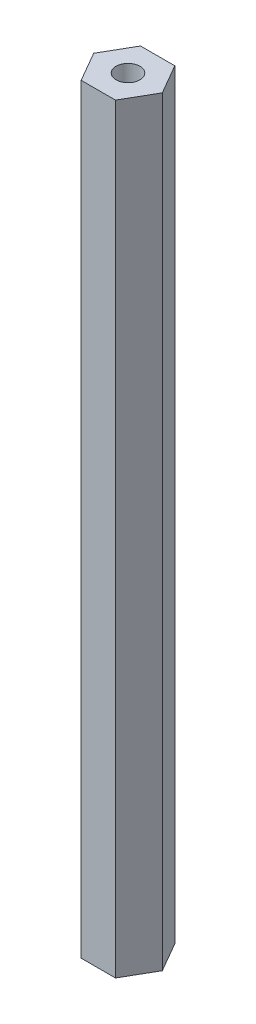
ISO-10303-21;
HEADER;
FILE_DESCRIPTION(('STEP AP214'),'2;1');
FILE_NAME('part.step','',(''),(''),'','','');
FILE_SCHEMA(('AUTOMOTIVE_DESIGN { 1 0 10303 214 1 1 1 1 }'));
ENDSEC;
DATA;
#1=APPLICATION_CONTEXT('core data for automotive mechanical design processes');
#2=APPLICATION_PROTOCOL_DEFINITION('international standard','automotive_design',2000,#1);
#3=PRODUCT_CONTEXT('',#1,'mechanical');
#4=PRODUCT('Part','Part','',(#3));
#5=PRODUCT_RELATED_PRODUCT_CATEGORY('part','',(#4));
#6=PRODUCT_DEFINITION_FORMATION('','',#4);
#7=PRODUCT_DEFINITION_CONTEXT('part definition',#1,'design');
#8=PRODUCT_DEFINITION('design','',#6,#7);
#9=PRODUCT_DEFINITION_SHAPE('','',#8);
#10=(LENGTH_UNIT() NAMED_UNIT(*) SI_UNIT(.MILLI.,.METRE.));
#11=(NAMED_UNIT(*) PLANE_ANGLE_UNIT() SI_UNIT($,.RADIAN.));
#12=(NAMED_UNIT(*) SI_UNIT($,.STERADIAN.) SOLID_ANGLE_UNIT());
#13=UNCERTAINTY_MEASURE_WITH_UNIT(LENGTH_MEASURE(1.E-05),#10,'distance_accuracy_value','');
#14=(GEOMETRIC_REPRESENTATION_CONTEXT(3) GLOBAL_UNCERTAINTY_ASSIGNED_CONTEXT((#13)) GLOBAL_UNIT_ASSIGNED_CONTEXT((#10,
#11,#12)) REPRESENTATION_CONTEXT('',''));
#15=CARTESIAN_POINT('',(0.,0.,0.));
#16=DIRECTION('',(0.,0.,1.));
#17=DIRECTION('',(1.,0.,0.));
#18=AXIS2_PLACEMENT_3D('',#15,#16,#17);
#19=CARTESIAN_POINT('',(0.,64.,0.));
#20=DIRECTION('',(0.,1.,0.));
#21=DIRECTION('',(0.,0.,1.));
#22=AXIS2_PLACEMENT_3D('',#19,#20,#21);
#23=PLANE('',#22);
#24=DIRECTION('',(0.499999999999995,0.,-0.866025403784441));
#25=VECTOR('',#24,1.);
#26=CARTESIAN_POINT('',(1.44337567297409,64.,2.49999999999997));
#27=LINE('',#26,#25);
#28=CARTESIAN_POINT('',(1.44337567297409,64.,2.49999999999997));
#29=VERTEX_POINT('',#28);
#30=CARTESIAN_POINT('',(2.88675134594811,64.,0.));
#31=VERTEX_POINT('',#30);
#32=EDGE_CURVE('E139',#29,#31,#27,.T.);
#33=ORIENTED_EDGE('',*,*,#32,.T.);
#34=DIRECTION('',(-0.500000000000001,0.,-0.866025403784438));
#35=VECTOR('',#34,1.);
#36=CARTESIAN_POINT('',(2.88675134594811,64.,0.));
#37=LINE('',#36,#35);
#38=CARTESIAN_POINT('',(1.44337567297405,64.,-2.49999999999999));
#39=VERTEX_POINT('',#38);
#40=EDGE_CURVE('E97',#31,#39,#37,.T.);
#41=ORIENTED_EDGE('',*,*,#40,.T.);
#42=DIRECTION('',(-1.,0.,0.));
#43=VECTOR('',#42,1.);
#44=CARTESIAN_POINT('',(1.44337567297405,64.,-2.49999999999999));
#45=LINE('',#44,#43);
#46=CARTESIAN_POINT('',(-1.44337567297407,64.,-2.49999999999998));
#47=VERTEX_POINT('',#46);
#48=EDGE_CURVE('E110',#39,#47,#45,.T.);
#49=ORIENTED_EDGE('',*,*,#48,.T.);
#50=DIRECTION('',(-0.499999999999995,0.,0.866025403784442));
#51=VECTOR('',#50,1.);
#52=CARTESIAN_POINT('',(-1.44337567297407,64.,-2.49999999999998));
#53=LINE('',#52,#51);
#54=CARTESIAN_POINT('',(-2.88675134594811,64.,0.));
#55=VERTEX_POINT('',#54);
#56=EDGE_CURVE('E104',#47,#55,#53,.T.);
#57=ORIENTED_EDGE('',*,*,#56,.T.);
#58=DIRECTION('',(0.500000000000007,0.,0.866025403784435));
#59=VECTOR('',#58,1.);
#60=CARTESIAN_POINT('',(-2.88675134594811,64.,0.));
#61=LINE('',#60,#59);
#62=CARTESIAN_POINT('',(-1.44337567297403,64.,2.5));
#63=VERTEX_POINT('',#62);
#64=EDGE_CURVE('E108',#55,#63,#61,.T.);
#65=ORIENTED_EDGE('',*,*,#64,.T.);
#66=DIRECTION('',(1.,0.,0.));
#67=VECTOR('',#66,1.);
#68=CARTESIAN_POINT('',(-1.44337567297403,64.,2.5));
#69=LINE('',#68,#67);
#70=EDGE_CURVE('E60',#63,#29,#69,.T.);
#71=ORIENTED_EDGE('',*,*,#70,.T.);
#72=EDGE_LOOP('',(#33,#41,#49,#57,#65,#71));
#73=FACE_BOUND('',#72,.T.);
#74=CARTESIAN_POINT('',(0.,64.,0.));
#75=DIRECTION('',(0.,1.,0.));
#76=DIRECTION('',(0.,0.,1.));
#77=AXIS2_PLACEMENT_3D('',#74,#75,#76);
#78=CIRCLE('',#77,1.);
#79=CARTESIAN_POINT('',(0.,64.,1.));
#80=VERTEX_POINT('',#79);
#81=EDGE_CURVE('E132',#80,#80,#78,.T.);
#82=ORIENTED_EDGE('',*,*,#81,.F.);
#83=EDGE_LOOP('',(#82));
#84=FACE_BOUND('',#83,.T.);
#85=ADVANCED_FACE('F43',(#73,#84),#23,.T.);
#86=CARTESIAN_POINT('',(0.,0.,0.));
#87=DIRECTION('',(0.,1.,0.));
#88=DIRECTION('',(0.,0.,1.));
#89=AXIS2_PLACEMENT_3D('',#86,#87,#88);
#90=PLANE('',#89);
#91=DIRECTION('',(0.499999999999995,0.,-0.866025403784441));
#92=VECTOR('',#91,1.);
#93=CARTESIAN_POINT('',(1.44337567297409,0.,2.49999999999997));
#94=LINE('',#93,#92);
#95=CARTESIAN_POINT('',(1.44337567297409,0.,2.49999999999997));
#96=VERTEX_POINT('',#95);
#97=CARTESIAN_POINT('',(2.88675134594811,0.,0.));
#98=VERTEX_POINT('',#97);
#99=EDGE_CURVE('E128',#96,#98,#94,.T.);
#100=ORIENTED_EDGE('',*,*,#99,.F.);
#101=DIRECTION('',(1.,0.,0.));
#102=VECTOR('',#101,1.);
#103=CARTESIAN_POINT('',(-1.44337567297403,0.,2.5));
#104=LINE('',#103,#102);
#105=CARTESIAN_POINT('',(-1.44337567297403,0.,2.5));
#106=VERTEX_POINT('',#105);
#107=EDGE_CURVE('E89',#106,#96,#104,.T.);
#108=ORIENTED_EDGE('',*,*,#107,.F.);
#109=DIRECTION('',(0.500000000000007,0.,0.866025403784435));
#110=VECTOR('',#109,1.);
#111=CARTESIAN_POINT('',(-2.88675134594811,0.,0.));
#112=LINE('',#111,#110);
#113=CARTESIAN_POINT('',(-2.88675134594811,0.,0.));
#114=VERTEX_POINT('',#113);
#115=EDGE_CURVE('E83',#114,#106,#112,.T.);
#116=ORIENTED_EDGE('',*,*,#115,.F.);
#117=DIRECTION('',(-0.499999999999995,0.,0.866025403784442));
#118=VECTOR('',#117,1.);
#119=CARTESIAN_POINT('',(-1.44337567297407,0.,-2.49999999999998));
#120=LINE('',#119,#118);
#121=CARTESIAN_POINT('',(-1.44337567297407,0.,-2.49999999999998));
#122=VERTEX_POINT('',#121);
#123=EDGE_CURVE('E118',#122,#114,#120,.T.);
#124=ORIENTED_EDGE('',*,*,#123,.F.);
#125=DIRECTION('',(-1.,0.,0.));
#126=VECTOR('',#125,1.);
#127=CARTESIAN_POINT('',(1.44337567297405,0.,-2.49999999999999));
#128=LINE('',#127,#126);
#129=CARTESIAN_POINT('',(1.44337567297405,0.,-2.49999999999999));
#130=VERTEX_POINT('',#129);
#131=EDGE_CURVE('E134',#130,#122,#128,.T.);
#132=ORIENTED_EDGE('',*,*,#131,.F.);
#133=DIRECTION('',(-0.500000000000001,0.,-0.866025403784438));
#134=VECTOR('',#133,1.);
#135=CARTESIAN_POINT('',(2.88675134594811,0.,0.));
#136=LINE('',#135,#134);
#137=EDGE_CURVE('E131',#98,#130,#136,.T.);
#138=ORIENTED_EDGE('',*,*,#137,.F.);
#139=EDGE_LOOP('',(#100,#108,#116,#124,#132,#138));
#140=FACE_BOUND('',#139,.T.);
#141=CARTESIAN_POINT('',(0.,0.,0.));
#142=DIRECTION('',(0.,1.,0.));
#143=DIRECTION('',(0.,0.,1.));
#144=AXIS2_PLACEMENT_3D('',#141,#142,#143);
#145=CIRCLE('',#144,1.);
#146=CARTESIAN_POINT('',(0.,0.,1.));
#147=VERTEX_POINT('',#146);
#148=EDGE_CURVE('E232',#147,#147,#145,.T.);
#149=ORIENTED_EDGE('',*,*,#148,.T.);
#150=EDGE_LOOP('',(#149));
#151=FACE_BOUND('',#150,.T.);
#152=ADVANCED_FACE('F148',(#140,#151),#90,.F.);
#153=CARTESIAN_POINT('',(1.44337567297409,64.,2.49999999999997));
#154=DIRECTION('',(-0.866025403784441,0.,-0.499999999999995));
#155=DIRECTION('',(-0.499999999999995,0.,0.866025403784442));
#156=AXIS2_PLACEMENT_3D('',#153,#154,#155);
#157=PLANE('',#156);
#158=ORIENTED_EDGE('',*,*,#99,.T.);
#159=DIRECTION('',(0.,-1.,0.));
#160=VECTOR('',#159,1.);
#161=CARTESIAN_POINT('',(2.88675134594811,64.,0.));
#162=LINE('',#161,#160);
#163=EDGE_CURVE('E11',#31,#98,#162,.T.);
#164=ORIENTED_EDGE('',*,*,#163,.F.);
#165=ORIENTED_EDGE('',*,*,#32,.F.);
#166=DIRECTION('',(0.,-1.,0.));
#167=VECTOR('',#166,1.);
#168=CARTESIAN_POINT('',(1.44337567297409,64.,2.49999999999997));
#169=LINE('',#168,#167);
#170=EDGE_CURVE('E124',#29,#96,#169,.T.);
#171=ORIENTED_EDGE('',*,*,#170,.T.);
#172=EDGE_LOOP('',(#158,#164,#165,#171));
#173=FACE_BOUND('',#172,.T.);
#174=ADVANCED_FACE('F45',(#173),#157,.F.);
#175=CARTESIAN_POINT('',(2.88675134594811,64.,0.));
#176=DIRECTION('',(-0.866025403784438,0.,0.500000000000001));
#177=DIRECTION('',(0.500000000000001,0.,0.866025403784438));
#178=AXIS2_PLACEMENT_3D('',#175,#176,#177);
#179=PLANE('',#178);
#180=ORIENTED_EDGE('',*,*,#137,.T.);
#181=DIRECTION('',(0.,-1.,0.));
#182=VECTOR('',#181,1.);
#183=CARTESIAN_POINT('',(1.44337567297405,64.,-2.49999999999999));
#184=LINE('',#183,#182);
#185=EDGE_CURVE('E52',#39,#130,#184,.T.);
#186=ORIENTED_EDGE('',*,*,#185,.F.);
#187=ORIENTED_EDGE('',*,*,#40,.F.);
#188=ORIENTED_EDGE('',*,*,#163,.T.);
#189=EDGE_LOOP('',(#180,#186,#187,#188));
#190=FACE_BOUND('',#189,.T.);
#191=ADVANCED_FACE('F173',(#190),#179,.F.);
#192=CARTESIAN_POINT('',(1.44337567297405,64.,-2.49999999999999));
#193=DIRECTION('',(0.,0.,1.));
#194=DIRECTION('',(1.,0.,0.));
#195=AXIS2_PLACEMENT_3D('',#192,#193,#194);
#196=PLANE('',#195);
#197=ORIENTED_EDGE('',*,*,#131,.T.);
#198=DIRECTION('',(0.,-1.,0.));
#199=VECTOR('',#198,1.);
#200=CARTESIAN_POINT('',(-1.44337567297407,64.,-2.49999999999998));
#201=LINE('',#200,#199);
#202=EDGE_CURVE('E119',#47,#122,#201,.T.);
#203=ORIENTED_EDGE('',*,*,#202,.F.);
#204=ORIENTED_EDGE('',*,*,#48,.F.);
#205=ORIENTED_EDGE('',*,*,#185,.T.);
#206=EDGE_LOOP('',(#197,#203,#204,#205));
#207=FACE_BOUND('',#206,.T.);
#208=ADVANCED_FACE('F145',(#207),#196,.F.);
#209=CARTESIAN_POINT('',(-1.44337567297407,64.,-2.49999999999998));
#210=DIRECTION('',(0.866025403784442,0.,0.499999999999995));
#211=DIRECTION('',(0.499999999999995,0.,-0.866025403784442));
#212=AXIS2_PLACEMENT_3D('',#209,#210,#211);
#213=PLANE('',#212);
#214=ORIENTED_EDGE('',*,*,#123,.T.);
#215=DIRECTION('',(0.,-1.,0.));
#216=VECTOR('',#215,1.);
#217=CARTESIAN_POINT('',(-2.88675134594811,64.,0.));
#218=LINE('',#217,#216);
#219=EDGE_CURVE('E115',#55,#114,#218,.T.);
#220=ORIENTED_EDGE('',*,*,#219,.F.);
#221=ORIENTED_EDGE('',*,*,#56,.F.);
#222=ORIENTED_EDGE('',*,*,#202,.T.);
#223=EDGE_LOOP('',(#214,#220,#221,#222));
#224=FACE_BOUND('',#223,.T.);
#225=ADVANCED_FACE('F116',(#224),#213,.F.);
#226=CARTESIAN_POINT('',(-2.88675134594811,64.,0.));
#227=DIRECTION('',(0.866025403784435,0.,-0.500000000000007));
#228=DIRECTION('',(-0.500000000000007,0.,-0.866025403784435));
#229=AXIS2_PLACEMENT_3D('',#226,#227,#228);
#230=PLANE('',#229);
#231=ORIENTED_EDGE('',*,*,#115,.T.);
#232=DIRECTION('',(0.,-1.,0.));
#233=VECTOR('',#232,1.);
#234=CARTESIAN_POINT('',(-1.44337567297403,64.,2.5));
#235=LINE('',#234,#233);
#236=EDGE_CURVE('E120',#63,#106,#235,.T.);
#237=ORIENTED_EDGE('',*,*,#236,.F.);
#238=ORIENTED_EDGE('',*,*,#64,.F.);
#239=ORIENTED_EDGE('',*,*,#219,.T.);
#240=EDGE_LOOP('',(#231,#237,#238,#239));
#241=FACE_BOUND('',#240,.T.);
#242=ADVANCED_FACE('F122',(#241),#230,.F.);
#243=CARTESIAN_POINT('',(-1.44337567297403,64.,2.5));
#244=DIRECTION('',(0.,0.,-1.));
#245=DIRECTION('',(-1.,0.,0.));
#246=AXIS2_PLACEMENT_3D('',#243,#244,#245);
#247=PLANE('',#246);
#248=ORIENTED_EDGE('',*,*,#107,.T.);
#249=ORIENTED_EDGE('',*,*,#170,.F.);
#250=ORIENTED_EDGE('',*,*,#70,.F.);
#251=ORIENTED_EDGE('',*,*,#236,.T.);
#252=EDGE_LOOP('',(#248,#249,#250,#251));
#253=FACE_BOUND('',#252,.T.);
#254=ADVANCED_FACE('F153',(#253),#247,.F.);
#255=CARTESIAN_POINT('',(0.,64.,0.));
#256=DIRECTION('',(0.,-1.,0.));
#257=DIRECTION('',(0.,0.,-1.));
#258=AXIS2_PLACEMENT_3D('',#255,#256,#257);
#259=CYLINDRICAL_SURFACE('',#258,1.);
#260=ORIENTED_EDGE('',*,*,#81,.T.);
#261=EDGE_LOOP('',(#260));
#262=FACE_BOUND('',#261,.T.);
#263=ORIENTED_EDGE('',*,*,#148,.F.);
#264=EDGE_LOOP('',(#263));
#265=FACE_BOUND('',#264,.T.);
#266=ADVANCED_FACE('F155',(#262,#265),#259,.F.);
#267=CLOSED_SHELL('',(#85,#152,#174,#191,#208,#225,#242,#254,#266));
#268=MANIFOLD_SOLID_BREP('B2',#267);
#269=ADVANCED_BREP_SHAPE_REPRESENTATION('',(#18,#268),#14);
#270=SHAPE_DEFINITION_REPRESENTATION(#9,#269);
ENDSEC;
END-ISO-10303-21;
